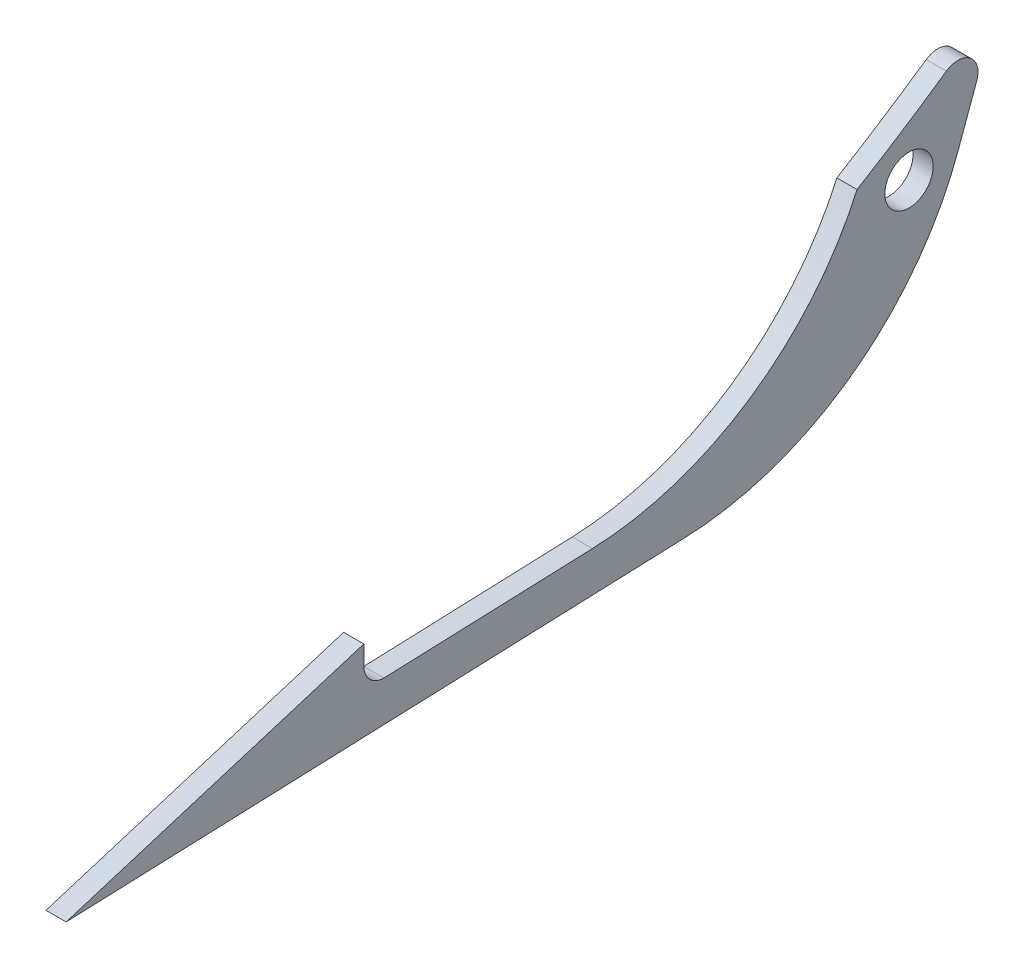
ISO-10303-21;
HEADER;
FILE_DESCRIPTION(('STEP AP214'),'2;1');
FILE_NAME('part.step','',(''),(''),'','','');
FILE_SCHEMA(('AUTOMOTIVE_DESIGN { 1 0 10303 214 1 1 1 1 }'));
ENDSEC;
DATA;
#1=APPLICATION_CONTEXT('core data for automotive mechanical design processes');
#2=APPLICATION_PROTOCOL_DEFINITION('international standard','automotive_design',2000,#1);
#3=PRODUCT_CONTEXT('',#1,'mechanical');
#4=PRODUCT('Part','Part','',(#3));
#5=PRODUCT_RELATED_PRODUCT_CATEGORY('part','',(#4));
#6=PRODUCT_DEFINITION_FORMATION('','',#4);
#7=PRODUCT_DEFINITION_CONTEXT('part definition',#1,'design');
#8=PRODUCT_DEFINITION('design','',#6,#7);
#9=PRODUCT_DEFINITION_SHAPE('','',#8);
#10=(LENGTH_UNIT() NAMED_UNIT(*) SI_UNIT(.MILLI.,.METRE.));
#11=(NAMED_UNIT(*) PLANE_ANGLE_UNIT() SI_UNIT($,.RADIAN.));
#12=(NAMED_UNIT(*) SI_UNIT($,.STERADIAN.) SOLID_ANGLE_UNIT());
#13=UNCERTAINTY_MEASURE_WITH_UNIT(LENGTH_MEASURE(1.E-05),#10,'distance_accuracy_value','');
#14=(GEOMETRIC_REPRESENTATION_CONTEXT(3) GLOBAL_UNCERTAINTY_ASSIGNED_CONTEXT((#13)) GLOBAL_UNIT_ASSIGNED_CONTEXT((#10,
#11,#12)) REPRESENTATION_CONTEXT('',''));
#15=CARTESIAN_POINT('',(0.,0.,0.));
#16=DIRECTION('',(0.,0.,1.));
#17=DIRECTION('',(1.,0.,0.));
#18=AXIS2_PLACEMENT_3D('',#15,#16,#17);
#19=CARTESIAN_POINT('',(5.,-13.0873297833222,77.345590470861));
#20=DIRECTION('',(0.,-0.999286994822303,-0.0377558204653474));
#21=DIRECTION('',(0.,0.0377558204653474,-0.999286994822303));
#22=AXIS2_PLACEMENT_3D('',#19,#20,#21);
#23=PLANE('',#22);
#24=DIRECTION('',(0.,-0.0377558204653474,0.999286994822303));
#25=VECTOR('',#24,1.);
#26=CARTESIAN_POINT('',(0.,-13.0873297833222,77.345590470861));
#27=LINE('',#26,#25);
#28=CARTESIAN_POINT('',(0.,-9.20715532038069,-25.351366731215));
#29=VERTEX_POINT('',#28);
#30=CARTESIAN_POINT('',(0.,-11.1608279835635,26.356678820338));
#31=VERTEX_POINT('',#30);
#32=EDGE_CURVE('E152',#29,#31,#27,.T.);
#33=ORIENTED_EDGE('',*,*,#32,.T.);
#34=DIRECTION('',(1.,0.,0.));
#35=VECTOR('',#34,1.);
#36=CARTESIAN_POINT('',(5.,-11.1608279835635,26.356678820338));
#37=LINE('',#36,#35);
#38=CARTESIAN_POINT('',(5.,-11.1608279835635,26.356678820338));
#39=VERTEX_POINT('',#38);
#40=EDGE_CURVE('E11',#31,#39,#37,.T.);
#41=ORIENTED_EDGE('',*,*,#40,.T.);
#42=DIRECTION('',(0.,-0.0377558204653474,0.999286994822303));
#43=VECTOR('',#42,1.);
#44=CARTESIAN_POINT('',(5.,-13.0873297833222,77.345590470861));
#45=LINE('',#44,#43);
#46=CARTESIAN_POINT('',(5.,-9.20715532038069,-25.351366731215));
#47=VERTEX_POINT('',#46);
#48=EDGE_CURVE('E164',#47,#39,#45,.T.);
#49=ORIENTED_EDGE('',*,*,#48,.F.);
#50=DIRECTION('',(-1.,0.,0.));
#51=VECTOR('',#50,1.);
#52=CARTESIAN_POINT('',(5.,-9.20715532038069,-25.351366731215));
#53=LINE('',#52,#51);
#54=EDGE_CURVE('E185',#47,#29,#53,.T.);
#55=ORIENTED_EDGE('',*,*,#54,.T.);
#56=EDGE_LOOP('',(#33,#41,#49,#55));
#57=FACE_BOUND('',#56,.T.);
#58=ADVANCED_FACE('F41',(#57),#23,.F.);
#59=CARTESIAN_POINT('',(5.,398.214009515141,128.31247679814));
#60=DIRECTION('',(-1.,0.,0.));
#61=DIRECTION('',(0.,0.,1.));
#62=AXIS2_PLACEMENT_3D('',#59,#60,#61);
#63=PLANE('',#62);
#64=DIRECTION('',(0.,-0.295103827863489,0.955465190773749));
#65=VECTOR('',#64,1.);
#66=CARTESIAN_POINT('',(5.,-24.1464120205903,105.187577253724));
#67=LINE('',#66,#65);
#68=CARTESIAN_POINT('',(5.,-1.34253931898173,31.3548969426378));
#69=VERTEX_POINT('',#68);
#70=CARTESIAN_POINT('',(5.,-24.1464120205902,105.187577253723));
#71=VERTEX_POINT('',#70);
#72=EDGE_CURVE('E126',#69,#71,#67,.T.);
#73=ORIENTED_EDGE('',*,*,#72,.T.);
#74=DIRECTION('',(0.,0.0377558204653473,-0.999286994822302));
#75=VECTOR('',#74,1.);
#76=CARTESIAN_POINT('',(5.,-25.8840673457626,151.178270781947));
#77=LINE('',#76,#75);
#78=CARTESIAN_POINT('',(5.,-18.3424918455112,-48.4253459581126));
#79=VERTEX_POINT('',#78);
#80=EDGE_CURVE('E131',#71,#79,#77,.T.);
#81=ORIENTED_EDGE('',*,*,#80,.T.);
#82=CARTESIAN_POINT('',(5.,56.6040327661615,-45.5936594232115));
#83=DIRECTION('',(-1.,0.,0.));
#84=DIRECTION('',(0.,0.,1.));
#85=AXIS2_PLACEMENT_3D('',#82,#83,#84);
#86=CIRCLE('',#85,75.);
#87=CARTESIAN_POINT('',(5.,30.9525220167372,-116.070605982155));
#88=VERTEX_POINT('',#87);
#89=EDGE_CURVE('E183',#79,#88,#86,.F.);
#90=ORIENTED_EDGE('',*,*,#89,.T.);
#91=DIRECTION('',(0.,0.939692620785913,-0.342020143325656));
#92=VECTOR('',#91,1.);
#93=CARTESIAN_POINT('',(5.,58.8862843819353,-126.237664014152));
#94=LINE('',#93,#92);
#95=CARTESIAN_POINT('',(5.,43.6222695731689,-120.682016968363));
#96=VERTEX_POINT('',#95);
#97=EDGE_CURVE('E151',#88,#96,#94,.T.);
#98=ORIENTED_EDGE('',*,*,#97,.T.);
#99=CARTESIAN_POINT('',(5.,45.3323702897972,-115.983553864433));
#100=DIRECTION('',(-1.,0.,0.));
#101=DIRECTION('',(0.,0.,1.));
#102=AXIS2_PLACEMENT_3D('',#99,#100,#101);
#103=CIRCLE('',#102,5.);
#104=CARTESIAN_POINT('',(5.,49.4433674640736,-113.137556283076));
#105=VERTEX_POINT('',#104);
#106=EDGE_CURVE('E49',#96,#105,#103,.F.);
#107=ORIENTED_EDGE('',*,*,#106,.T.);
#108=CARTESIAN_POINT('',(5.,398.214009515141,128.31247679814));
#109=DIRECTION('',(-1.,0.,0.));
#110=DIRECTION('',(0.,0.,1.));
#111=AXIS2_PLACEMENT_3D('',#108,#109,#110);
#112=CIRCLE('',#111,424.192266822056);
#113=CARTESIAN_POINT('',(5.,35.1000318015456,-90.9757317782553));
#114=VERTEX_POINT('',#113);
#115=EDGE_CURVE('E154',#105,#114,#112,.T.);
#116=ORIENTED_EDGE('',*,*,#115,.T.);
#117=CARTESIAN_POINT('',(5.,65.739369291292,-22.5196801963139));
#118=DIRECTION('',(-1.,0.,0.));
#119=DIRECTION('',(0.,0.,1.));
#120=AXIS2_PLACEMENT_3D('',#117,#118,#119);
#121=CIRCLE('',#120,75.);
#122=EDGE_CURVE('E191',#114,#47,#121,.T.);
#123=ORIENTED_EDGE('',*,*,#122,.T.);
#124=ORIENTED_EDGE('',*,*,#48,.T.);
#125=DIRECTION('',(0.,0.897914181940209,-0.440170559977204));
#126=VECTOR('',#125,1.);
#127=CARTESIAN_POINT('',(5.,-11.1571930897224,26.3548969426377));
#128=LINE('',#127,#126);
#129=CARTESIAN_POINT('',(5.,-11.1571930897224,26.3548969426377));
#130=VERTEX_POINT('',#129);
#131=EDGE_CURVE('E137',#39,#130,#128,.T.);
#132=ORIENTED_EDGE('',*,*,#131,.T.);
#133=CARTESIAN_POINT('',(5.,-6.1571930897223,26.3548969426377));
#134=DIRECTION('',(-1.,0.,0.));
#135=DIRECTION('',(0.,0.,1.));
#136=AXIS2_PLACEMENT_3D('',#133,#134,#135);
#137=CIRCLE('',#136,5.00000000000006);
#138=CARTESIAN_POINT('',(5.,-6.1571930897223,31.3548969426378));
#139=VERTEX_POINT('',#138);
#140=EDGE_CURVE('E254',#130,#139,#137,.T.);
#141=ORIENTED_EDGE('',*,*,#140,.T.);
#142=DIRECTION('',(0.,1.,0.));
#143=VECTOR('',#142,1.);
#144=CARTESIAN_POINT('',(5.,-1.34253931898173,31.3548969426378));
#145=LINE('',#144,#143);
#146=EDGE_CURVE('E135',#139,#69,#145,.T.);
#147=ORIENTED_EDGE('',*,*,#146,.T.);
#148=EDGE_LOOP('',(#73,#81,#90,#98,#107,#116,#123,#124,#132,#141,#147));
#149=FACE_BOUND('',#148,.T.);
#150=CARTESIAN_POINT('',(5.,30.6985153652574,-103.870185422396));
#151=DIRECTION('',(1.,0.,0.));
#152=DIRECTION('',(0.,0.,-1.));
#153=AXIS2_PLACEMENT_3D('',#150,#151,#152);
#154=CIRCLE('',#153,5.99999999999999);
#155=CARTESIAN_POINT('',(5.,30.6985153652574,-109.870185422396));
#156=VERTEX_POINT('',#155);
#157=EDGE_CURVE('E171',#156,#156,#154,.T.);
#158=ORIENTED_EDGE('',*,*,#157,.F.);
#159=EDGE_LOOP('',(#158));
#160=FACE_BOUND('',#159,.T.);
#161=ADVANCED_FACE('F128',(#149,#160),#63,.F.);
#162=CARTESIAN_POINT('',(0.,398.214009515141,128.31247679814));
#163=DIRECTION('',(-1.,0.,0.));
#164=DIRECTION('',(0.,0.,1.));
#165=AXIS2_PLACEMENT_3D('',#162,#163,#164);
#166=PLANE('',#165);
#167=DIRECTION('',(0.,0.0377558204653473,-0.999286994822302));
#168=VECTOR('',#167,1.);
#169=CARTESIAN_POINT('',(0.,-25.8840673457626,151.178270781947));
#170=LINE('',#169,#168);
#171=CARTESIAN_POINT('',(0.,-24.1464120205902,105.187577253723));
#172=VERTEX_POINT('',#171);
#173=CARTESIAN_POINT('',(0.,-18.3424918455112,-48.4253459581126));
#174=VERTEX_POINT('',#173);
#175=EDGE_CURVE('E168',#172,#174,#170,.T.);
#176=ORIENTED_EDGE('',*,*,#175,.F.);
#177=DIRECTION('',(0.,-0.295103827863489,0.955465190773749));
#178=VECTOR('',#177,1.);
#179=CARTESIAN_POINT('',(0.,-24.1464120205903,105.187577253724));
#180=LINE('',#179,#178);
#181=CARTESIAN_POINT('',(0.,-1.34253931898173,31.3548969426378));
#182=VERTEX_POINT('',#181);
#183=EDGE_CURVE('E143',#182,#172,#180,.T.);
#184=ORIENTED_EDGE('',*,*,#183,.F.);
#185=DIRECTION('',(0.,1.,0.));
#186=VECTOR('',#185,1.);
#187=CARTESIAN_POINT('',(0.,-1.34253931898173,31.3548969426378));
#188=LINE('',#187,#186);
#189=CARTESIAN_POINT('',(0.,-6.1571930897223,31.3548969426378));
#190=VERTEX_POINT('',#189);
#191=EDGE_CURVE('E246',#190,#182,#188,.T.);
#192=ORIENTED_EDGE('',*,*,#191,.F.);
#193=CARTESIAN_POINT('',(0.,-6.1571930897223,26.3548969426377));
#194=DIRECTION('',(-1.,0.,0.));
#195=DIRECTION('',(0.,0.,1.));
#196=AXIS2_PLACEMENT_3D('',#193,#194,#195);
#197=CIRCLE('',#196,5.00000000000006);
#198=CARTESIAN_POINT('',(0.,-11.1571930897224,26.3548969426377));
#199=VERTEX_POINT('',#198);
#200=EDGE_CURVE('E259',#199,#190,#197,.T.);
#201=ORIENTED_EDGE('',*,*,#200,.F.);
#202=DIRECTION('',(0.,0.897914181940209,-0.440170559977204));
#203=VECTOR('',#202,1.);
#204=CARTESIAN_POINT('',(0.,-11.1571930897224,26.3548969426377));
#205=LINE('',#204,#203);
#206=EDGE_CURVE('E248',#31,#199,#205,.T.);
#207=ORIENTED_EDGE('',*,*,#206,.F.);
#208=ORIENTED_EDGE('',*,*,#32,.F.);
#209=CARTESIAN_POINT('',(0.,65.739369291292,-22.5196801963139));
#210=DIRECTION('',(-1.,0.,0.));
#211=DIRECTION('',(0.,0.,1.));
#212=AXIS2_PLACEMENT_3D('',#209,#210,#211);
#213=CIRCLE('',#212,75.);
#214=CARTESIAN_POINT('',(0.,35.1000318015456,-90.9757317782553));
#215=VERTEX_POINT('',#214);
#216=EDGE_CURVE('E188',#29,#215,#213,.F.);
#217=ORIENTED_EDGE('',*,*,#216,.T.);
#218=CARTESIAN_POINT('',(0.,398.214009515141,128.31247679814));
#219=DIRECTION('',(-1.,0.,0.));
#220=DIRECTION('',(0.,0.,1.));
#221=AXIS2_PLACEMENT_3D('',#218,#219,#220);
#222=CIRCLE('',#221,424.192266822056);
#223=CARTESIAN_POINT('',(0.,49.4433674640736,-113.137556283076));
#224=VERTEX_POINT('',#223);
#225=EDGE_CURVE('E157',#224,#215,#222,.T.);
#226=ORIENTED_EDGE('',*,*,#225,.F.);
#227=CARTESIAN_POINT('',(0.,45.3323702897972,-115.983553864433));
#228=DIRECTION('',(-1.,0.,0.));
#229=DIRECTION('',(0.,0.,1.));
#230=AXIS2_PLACEMENT_3D('',#227,#228,#229);
#231=CIRCLE('',#230,5.);
#232=CARTESIAN_POINT('',(0.,43.6222695731689,-120.682016968363));
#233=VERTEX_POINT('',#232);
#234=EDGE_CURVE('E64',#224,#233,#231,.T.);
#235=ORIENTED_EDGE('',*,*,#234,.T.);
#236=DIRECTION('',(0.,0.939692620785913,-0.342020143325656));
#237=VECTOR('',#236,1.);
#238=CARTESIAN_POINT('',(0.,58.8862843819353,-126.237664014152));
#239=LINE('',#238,#237);
#240=CARTESIAN_POINT('',(0.,30.9525220167372,-116.070605982155));
#241=VERTEX_POINT('',#240);
#242=EDGE_CURVE('E170',#241,#233,#239,.T.);
#243=ORIENTED_EDGE('',*,*,#242,.F.);
#244=CARTESIAN_POINT('',(0.,56.6040327661615,-45.5936594232115));
#245=DIRECTION('',(-1.,0.,0.));
#246=DIRECTION('',(0.,0.,1.));
#247=AXIS2_PLACEMENT_3D('',#244,#245,#246);
#248=CIRCLE('',#247,75.);
#249=EDGE_CURVE('E179',#241,#174,#248,.T.);
#250=ORIENTED_EDGE('',*,*,#249,.T.);
#251=EDGE_LOOP('',(#176,#184,#192,#201,#207,#208,#217,#226,#235,#243,#250));
#252=FACE_BOUND('',#251,.T.);
#253=CARTESIAN_POINT('',(0.,30.6985153652574,-103.870185422396));
#254=DIRECTION('',(1.,0.,0.));
#255=DIRECTION('',(0.,0.,-1.));
#256=AXIS2_PLACEMENT_3D('',#253,#254,#255);
#257=CIRCLE('',#256,5.99999999999999);
#258=CARTESIAN_POINT('',(0.,30.6985153652574,-109.870185422396));
#259=VERTEX_POINT('',#258);
#260=EDGE_CURVE('E160',#259,#259,#257,.T.);
#261=ORIENTED_EDGE('',*,*,#260,.T.);
#262=EDGE_LOOP('',(#261));
#263=FACE_BOUND('',#262,.T.);
#264=ADVANCED_FACE('F222',(#252,#263),#166,.T.);
#265=CARTESIAN_POINT('',(5.,-25.8840673457626,151.178270781947));
#266=DIRECTION('',(0.,0.999286994822303,0.0377558204653473));
#267=DIRECTION('',(0.,-0.0377558204653473,0.999286994822303));
#268=AXIS2_PLACEMENT_3D('',#265,#266,#267);
#269=PLANE('',#268);
#270=ORIENTED_EDGE('',*,*,#80,.F.);
#271=DIRECTION('',(-1.,0.,0.));
#272=VECTOR('',#271,1.);
#273=CARTESIAN_POINT('',(5.,-24.1464120205903,105.187577253724));
#274=LINE('',#273,#272);
#275=EDGE_CURVE('E140',#71,#172,#274,.T.);
#276=ORIENTED_EDGE('',*,*,#275,.T.);
#277=ORIENTED_EDGE('',*,*,#175,.T.);
#278=DIRECTION('',(-1.,0.,0.));
#279=VECTOR('',#278,1.);
#280=CARTESIAN_POINT('',(5.,-18.3424918455112,-48.4253459581126));
#281=LINE('',#280,#279);
#282=EDGE_CURVE('E149',#174,#79,#281,.F.);
#283=ORIENTED_EDGE('',*,*,#282,.T.);
#284=EDGE_LOOP('',(#270,#276,#277,#283));
#285=FACE_BOUND('',#284,.T.);
#286=ADVANCED_FACE('F147',(#285),#269,.F.);
#287=CARTESIAN_POINT('',(5.,58.8862843819353,-126.237664014152));
#288=DIRECTION('',(0.,0.342020143325656,0.939692620785913));
#289=DIRECTION('',(0.,-0.939692620785913,0.342020143325656));
#290=AXIS2_PLACEMENT_3D('',#287,#288,#289);
#291=PLANE('',#290);
#292=ORIENTED_EDGE('',*,*,#242,.T.);
#293=DIRECTION('',(-1.,0.,0.));
#294=VECTOR('',#293,1.);
#295=CARTESIAN_POINT('',(5.,43.6222695731689,-120.682016968363));
#296=LINE('',#295,#294);
#297=EDGE_CURVE('E56',#233,#96,#296,.F.);
#298=ORIENTED_EDGE('',*,*,#297,.T.);
#299=ORIENTED_EDGE('',*,*,#97,.F.);
#300=DIRECTION('',(-1.,0.,0.));
#301=VECTOR('',#300,1.);
#302=CARTESIAN_POINT('',(5.,30.9525220167372,-116.070605982155));
#303=LINE('',#302,#301);
#304=EDGE_CURVE('E176',#88,#241,#303,.T.);
#305=ORIENTED_EDGE('',*,*,#304,.T.);
#306=EDGE_LOOP('',(#292,#298,#299,#305));
#307=FACE_BOUND('',#306,.T.);
#308=ADVANCED_FACE('F229',(#307),#291,.F.);
#309=CARTESIAN_POINT('',(5.,398.214009515141,128.31247679814));
#310=DIRECTION('',(-1.,0.,0.));
#311=DIRECTION('',(0.,0.,1.));
#312=AXIS2_PLACEMENT_3D('',#309,#310,#311);
#313=CYLINDRICAL_SURFACE('',#312,424.192266822056);
#314=ORIENTED_EDGE('',*,*,#115,.F.);
#315=DIRECTION('',(-1.,0.,0.));
#316=VECTOR('',#315,1.);
#317=CARTESIAN_POINT('',(5.,49.4433674640735,-113.137556283076));
#318=LINE('',#317,#316);
#319=EDGE_CURVE('E193',#105,#224,#318,.T.);
#320=ORIENTED_EDGE('',*,*,#319,.T.);
#321=ORIENTED_EDGE('',*,*,#225,.T.);
#322=DIRECTION('',(-1.,0.,0.));
#323=VECTOR('',#322,1.);
#324=CARTESIAN_POINT('',(5.,35.1000318015456,-90.9757317782553));
#325=LINE('',#324,#323);
#326=EDGE_CURVE('E167',#114,#215,#325,.T.);
#327=ORIENTED_EDGE('',*,*,#326,.F.);
#328=EDGE_LOOP('',(#314,#320,#321,#327));
#329=FACE_BOUND('',#328,.T.);
#330=ADVANCED_FACE('F203',(#329),#313,.F.);
#331=CARTESIAN_POINT('',(5.,30.6985153652574,-103.870185422396));
#332=DIRECTION('',(-1.,0.,0.));
#333=DIRECTION('',(0.,0.,1.));
#334=AXIS2_PLACEMENT_3D('',#331,#332,#333);
#335=CYLINDRICAL_SURFACE('',#334,5.99999999999999);
#336=ORIENTED_EDGE('',*,*,#157,.T.);
#337=EDGE_LOOP('',(#336));
#338=FACE_BOUND('',#337,.T.);
#339=ORIENTED_EDGE('',*,*,#260,.F.);
#340=EDGE_LOOP('',(#339));
#341=FACE_BOUND('',#340,.T.);
#342=ADVANCED_FACE('F228',(#338,#341),#335,.F.);
#343=CARTESIAN_POINT('',(5.,56.6040327661615,-45.5936594232115));
#344=DIRECTION('',(-1.,0.,0.));
#345=DIRECTION('',(0.,0.,1.));
#346=AXIS2_PLACEMENT_3D('',#343,#344,#345);
#347=CYLINDRICAL_SURFACE('',#346,75.);
#348=ORIENTED_EDGE('',*,*,#89,.F.);
#349=ORIENTED_EDGE('',*,*,#282,.F.);
#350=ORIENTED_EDGE('',*,*,#249,.F.);
#351=ORIENTED_EDGE('',*,*,#304,.F.);
#352=EDGE_LOOP('',(#348,#349,#350,#351));
#353=FACE_BOUND('',#352,.T.);
#354=ADVANCED_FACE('F214',(#353),#347,.T.);
#355=CARTESIAN_POINT('',(5.,65.739369291292,-22.5196801963139));
#356=DIRECTION('',(-1.,0.,0.));
#357=DIRECTION('',(0.,0.,1.));
#358=AXIS2_PLACEMENT_3D('',#355,#356,#357);
#359=CYLINDRICAL_SURFACE('',#358,75.);
#360=ORIENTED_EDGE('',*,*,#122,.F.);
#361=ORIENTED_EDGE('',*,*,#326,.T.);
#362=ORIENTED_EDGE('',*,*,#216,.F.);
#363=ORIENTED_EDGE('',*,*,#54,.F.);
#364=EDGE_LOOP('',(#360,#361,#362,#363));
#365=FACE_BOUND('',#364,.T.);
#366=ADVANCED_FACE('F207',(#365),#359,.F.);
#367=CARTESIAN_POINT('',(5.,45.3323702897972,-115.983553864433));
#368=DIRECTION('',(-1.,0.,0.));
#369=DIRECTION('',(0.,0.,1.));
#370=AXIS2_PLACEMENT_3D('',#367,#368,#369);
#371=CYLINDRICAL_SURFACE('',#370,5.);
#372=ORIENTED_EDGE('',*,*,#106,.F.);
#373=ORIENTED_EDGE('',*,*,#297,.F.);
#374=ORIENTED_EDGE('',*,*,#234,.F.);
#375=ORIENTED_EDGE('',*,*,#319,.F.);
#376=EDGE_LOOP('',(#372,#373,#374,#375));
#377=FACE_BOUND('',#376,.T.);
#378=ADVANCED_FACE('F43',(#377),#371,.T.);
#379=CARTESIAN_POINT('',(0.,-11.1571930897224,26.3548969426377));
#380=DIRECTION('',(0.,-0.440170559977204,-0.897914181940209));
#381=DIRECTION('',(0.,0.897914181940209,-0.440170559977204));
#382=AXIS2_PLACEMENT_3D('',#379,#380,#381);
#383=PLANE('',#382);
#384=ORIENTED_EDGE('',*,*,#40,.F.);
#385=ORIENTED_EDGE('',*,*,#206,.T.);
#386=DIRECTION('',(1.,0.,0.));
#387=VECTOR('',#386,1.);
#388=CARTESIAN_POINT('',(0.,-11.1571930897224,26.3548969426377));
#389=LINE('',#388,#387);
#390=EDGE_CURVE('E264',#199,#130,#389,.T.);
#391=ORIENTED_EDGE('',*,*,#390,.T.);
#392=ORIENTED_EDGE('',*,*,#131,.F.);
#393=EDGE_LOOP('',(#384,#385,#391,#392));
#394=FACE_BOUND('',#393,.T.);
#395=ADVANCED_FACE('F206',(#394),#383,.T.);
#396=CARTESIAN_POINT('',(0.,-24.1464120205903,105.187577253724));
#397=DIRECTION('',(0.,0.955465190773749,0.295103827863489));
#398=DIRECTION('',(0.,-0.295103827863489,0.955465190773749));
#399=AXIS2_PLACEMENT_3D('',#396,#397,#398);
#400=PLANE('',#399);
#401=ORIENTED_EDGE('',*,*,#183,.T.);
#402=ORIENTED_EDGE('',*,*,#275,.F.);
#403=ORIENTED_EDGE('',*,*,#72,.F.);
#404=DIRECTION('',(1.,0.,0.));
#405=VECTOR('',#404,1.);
#406=CARTESIAN_POINT('',(0.,-1.34253931898173,31.3548969426378));
#407=LINE('',#406,#405);
#408=EDGE_CURVE('E252',#182,#69,#407,.T.);
#409=ORIENTED_EDGE('',*,*,#408,.F.);
#410=EDGE_LOOP('',(#401,#402,#403,#409));
#411=FACE_BOUND('',#410,.T.);
#412=ADVANCED_FACE('F141',(#411),#400,.T.);
#413=CARTESIAN_POINT('',(0.,-1.34253931898173,31.3548969426378));
#414=DIRECTION('',(0.,0.,-1.));
#415=DIRECTION('',(-1.,0.,0.));
#416=AXIS2_PLACEMENT_3D('',#413,#414,#415);
#417=PLANE('',#416);
#418=ORIENTED_EDGE('',*,*,#146,.F.);
#419=DIRECTION('',(1.,0.,0.));
#420=VECTOR('',#419,1.);
#421=CARTESIAN_POINT('',(0.,-6.1571930897223,31.3548969426378));
#422=LINE('',#421,#420);
#423=EDGE_CURVE('E253',#190,#139,#422,.T.);
#424=ORIENTED_EDGE('',*,*,#423,.F.);
#425=ORIENTED_EDGE('',*,*,#191,.T.);
#426=ORIENTED_EDGE('',*,*,#408,.T.);
#427=EDGE_LOOP('',(#418,#424,#425,#426));
#428=FACE_BOUND('',#427,.T.);
#429=ADVANCED_FACE('F251',(#428),#417,.T.);
#430=CARTESIAN_POINT('',(0.,-6.1571930897223,26.3548969426377));
#431=DIRECTION('',(1.,0.,0.));
#432=DIRECTION('',(0.,0.,-1.));
#433=AXIS2_PLACEMENT_3D('',#430,#431,#432);
#434=CYLINDRICAL_SURFACE('',#433,5.00000000000006);
#435=ORIENTED_EDGE('',*,*,#140,.F.);
#436=ORIENTED_EDGE('',*,*,#390,.F.);
#437=ORIENTED_EDGE('',*,*,#200,.T.);
#438=ORIENTED_EDGE('',*,*,#423,.T.);
#439=EDGE_LOOP('',(#435,#436,#437,#438));
#440=FACE_BOUND('',#439,.T.);
#441=ADVANCED_FACE('F362',(#440),#434,.F.);
#442=CLOSED_SHELL('',(#58,#161,#264,#286,#308,#330,#342,#354,#366,#378,#395,#412,#429,#441));
#443=MANIFOLD_SOLID_BREP('B2',#442);
#444=ADVANCED_BREP_SHAPE_REPRESENTATION('',(#18,#443),#14);
#445=SHAPE_DEFINITION_REPRESENTATION(#9,#444);
ENDSEC;
END-ISO-10303-21;
